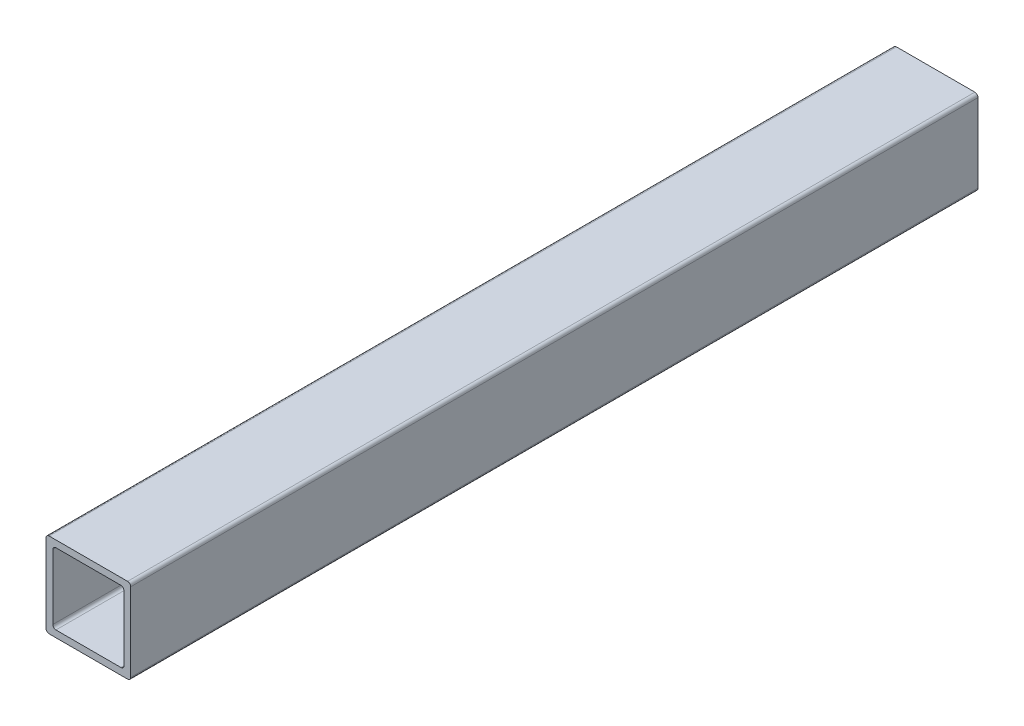
ISO-10303-21;
HEADER;
FILE_DESCRIPTION(('STEP AP214'),'2;1');
FILE_NAME('part.step','',(''),(''),'','','');
FILE_SCHEMA(('AUTOMOTIVE_DESIGN { 1 0 10303 214 1 1 1 1 }'));
ENDSEC;
DATA;
#1=APPLICATION_CONTEXT('core data for automotive mechanical design processes');
#2=APPLICATION_PROTOCOL_DEFINITION('international standard','automotive_design',2000,#1);
#3=PRODUCT_CONTEXT('',#1,'mechanical');
#4=PRODUCT('Part','Part','',(#3));
#5=PRODUCT_RELATED_PRODUCT_CATEGORY('part','',(#4));
#6=PRODUCT_DEFINITION_FORMATION('','',#4);
#7=PRODUCT_DEFINITION_CONTEXT('part definition',#1,'design');
#8=PRODUCT_DEFINITION('design','',#6,#7);
#9=PRODUCT_DEFINITION_SHAPE('','',#8);
#10=(LENGTH_UNIT() NAMED_UNIT(*) SI_UNIT(.MILLI.,.METRE.));
#11=(NAMED_UNIT(*) PLANE_ANGLE_UNIT() SI_UNIT($,.RADIAN.));
#12=(NAMED_UNIT(*) SI_UNIT($,.STERADIAN.) SOLID_ANGLE_UNIT());
#13=UNCERTAINTY_MEASURE_WITH_UNIT(LENGTH_MEASURE(1.E-05),#10,'distance_accuracy_value','');
#14=(GEOMETRIC_REPRESENTATION_CONTEXT(3) GLOBAL_UNCERTAINTY_ASSIGNED_CONTEXT((#13)) GLOBAL_UNIT_ASSIGNED_CONTEXT((#10,
#11,#12)) REPRESENTATION_CONTEXT('',''));
#15=CARTESIAN_POINT('',(0.,0.,0.));
#16=DIRECTION('',(0.,0.,1.));
#17=DIRECTION('',(1.,0.,0.));
#18=AXIS2_PLACEMENT_3D('',#15,#16,#17);
#19=CARTESIAN_POINT('',(23.153,23.153,500.));
#20=DIRECTION('',(0.,0.,-1.));
#21=DIRECTION('',(-1.,0.,0.));
#22=AXIS2_PLACEMENT_3D('',#19,#20,#21);
#23=PLANE('',#22);
#24=CARTESIAN_POINT('',(23.153,23.153,500.));
#25=DIRECTION('',(0.,0.,1.));
#26=DIRECTION('',(-1.,0.,0.));
#27=AXIS2_PLACEMENT_3D('',#24,#25,#26);
#28=CIRCLE('',#27,1.847);
#29=CARTESIAN_POINT('',(25.,23.153,500.));
#30=VERTEX_POINT('',#29);
#31=CARTESIAN_POINT('',(23.153,25.,500.));
#32=VERTEX_POINT('',#31);
#33=EDGE_CURVE('E195',#30,#32,#28,.T.);
#34=ORIENTED_EDGE('',*,*,#33,.T.);
#35=DIRECTION('',(-1.,0.,0.));
#36=VECTOR('',#35,1.);
#37=CARTESIAN_POINT('',(-23.153,25.,500.));
#38=LINE('',#37,#36);
#39=CARTESIAN_POINT('',(-23.153,25.,500.));
#40=VERTEX_POINT('',#39);
#41=EDGE_CURVE('E198',#32,#40,#38,.T.);
#42=ORIENTED_EDGE('',*,*,#41,.T.);
#43=CARTESIAN_POINT('',(-23.153,23.153,500.));
#44=DIRECTION('',(0.,0.,1.));
#45=DIRECTION('',(1.,0.,0.));
#46=AXIS2_PLACEMENT_3D('',#43,#44,#45);
#47=CIRCLE('',#46,1.847);
#48=CARTESIAN_POINT('',(-25.,23.153,500.));
#49=VERTEX_POINT('',#48);
#50=EDGE_CURVE('E201',#40,#49,#47,.T.);
#51=ORIENTED_EDGE('',*,*,#50,.T.);
#52=DIRECTION('',(0.,-1.,0.));
#53=VECTOR('',#52,1.);
#54=CARTESIAN_POINT('',(-25.,23.153,500.));
#55=LINE('',#54,#53);
#56=CARTESIAN_POINT('',(-25.,-23.153,500.));
#57=VERTEX_POINT('',#56);
#58=EDGE_CURVE('E203',#49,#57,#55,.T.);
#59=ORIENTED_EDGE('',*,*,#58,.T.);
#60=CARTESIAN_POINT('',(-23.153,-23.153,500.));
#61=DIRECTION('',(0.,0.,1.));
#62=DIRECTION('',(1.,0.,0.));
#63=AXIS2_PLACEMENT_3D('',#60,#61,#62);
#64=CIRCLE('',#63,1.847);
#65=CARTESIAN_POINT('',(-23.153,-25.,500.));
#66=VERTEX_POINT('',#65);
#67=EDGE_CURVE('E205',#57,#66,#64,.T.);
#68=ORIENTED_EDGE('',*,*,#67,.T.);
#69=DIRECTION('',(1.,0.,0.));
#70=VECTOR('',#69,1.);
#71=CARTESIAN_POINT('',(-23.153,-25.,500.));
#72=LINE('',#71,#70);
#73=CARTESIAN_POINT('',(23.153,-25.,500.));
#74=VERTEX_POINT('',#73);
#75=EDGE_CURVE('E207',#66,#74,#72,.T.);
#76=ORIENTED_EDGE('',*,*,#75,.T.);
#77=CARTESIAN_POINT('',(23.153,-23.153,500.));
#78=DIRECTION('',(0.,0.,1.));
#79=DIRECTION('',(1.,0.,0.));
#80=AXIS2_PLACEMENT_3D('',#77,#78,#79);
#81=CIRCLE('',#80,1.847);
#82=CARTESIAN_POINT('',(25.,-23.153,500.));
#83=VERTEX_POINT('',#82);
#84=EDGE_CURVE('E209',#74,#83,#81,.T.);
#85=ORIENTED_EDGE('',*,*,#84,.T.);
#86=DIRECTION('',(0.,1.,0.));
#87=VECTOR('',#86,1.);
#88=CARTESIAN_POINT('',(25.,23.153,500.));
#89=LINE('',#88,#87);
#90=EDGE_CURVE('E211',#83,#30,#89,.T.);
#91=ORIENTED_EDGE('',*,*,#90,.T.);
#92=EDGE_LOOP('',(#34,#42,#51,#59,#68,#76,#85,#91));
#93=FACE_BOUND('',#92,.T.);
#94=CARTESIAN_POINT('',(19.153,-19.153,500.));
#95=DIRECTION('',(0.,0.,1.));
#96=DIRECTION('',(1.,0.,0.));
#97=AXIS2_PLACEMENT_3D('',#94,#95,#96);
#98=CIRCLE('',#97,1.847);
#99=CARTESIAN_POINT('',(19.153,-21.,500.));
#100=VERTEX_POINT('',#99);
#101=CARTESIAN_POINT('',(21.,-19.153,500.));
#102=VERTEX_POINT('',#101);
#103=EDGE_CURVE('E130',#100,#102,#98,.T.);
#104=ORIENTED_EDGE('',*,*,#103,.F.);
#105=DIRECTION('',(1.,0.,0.));
#106=VECTOR('',#105,1.);
#107=CARTESIAN_POINT('',(-19.153,-21.,500.));
#108=LINE('',#107,#106);
#109=CARTESIAN_POINT('',(-19.153,-21.,500.));
#110=VERTEX_POINT('',#109);
#111=EDGE_CURVE('E163',#110,#100,#108,.T.);
#112=ORIENTED_EDGE('',*,*,#111,.F.);
#113=CARTESIAN_POINT('',(-19.153,-19.153,500.));
#114=DIRECTION('',(0.,0.,1.));
#115=DIRECTION('',(1.,0.,0.));
#116=AXIS2_PLACEMENT_3D('',#113,#114,#115);
#117=CIRCLE('',#116,1.847);
#118=CARTESIAN_POINT('',(-21.,-19.153,500.));
#119=VERTEX_POINT('',#118);
#120=EDGE_CURVE('E161',#119,#110,#117,.T.);
#121=ORIENTED_EDGE('',*,*,#120,.F.);
#122=DIRECTION('',(0.,-1.,0.));
#123=VECTOR('',#122,1.);
#124=CARTESIAN_POINT('',(-21.,19.153,500.));
#125=LINE('',#124,#123);
#126=CARTESIAN_POINT('',(-21.,19.153,500.));
#127=VERTEX_POINT('',#126);
#128=EDGE_CURVE('E159',#127,#119,#125,.T.);
#129=ORIENTED_EDGE('',*,*,#128,.F.);
#130=CARTESIAN_POINT('',(-19.153,19.153,500.));
#131=DIRECTION('',(0.,0.,1.));
#132=DIRECTION('',(1.,0.,0.));
#133=AXIS2_PLACEMENT_3D('',#130,#131,#132);
#134=CIRCLE('',#133,1.847);
#135=CARTESIAN_POINT('',(-19.153,21.,500.));
#136=VERTEX_POINT('',#135);
#137=EDGE_CURVE('E157',#136,#127,#134,.T.);
#138=ORIENTED_EDGE('',*,*,#137,.F.);
#139=DIRECTION('',(-1.,0.,0.));
#140=VECTOR('',#139,1.);
#141=CARTESIAN_POINT('',(-19.153,21.,500.));
#142=LINE('',#141,#140);
#143=CARTESIAN_POINT('',(19.153,21.,500.));
#144=VERTEX_POINT('',#143);
#145=EDGE_CURVE('E153',#144,#136,#142,.T.);
#146=ORIENTED_EDGE('',*,*,#145,.F.);
#147=CARTESIAN_POINT('',(19.153,19.153,500.));
#148=DIRECTION('',(0.,0.,1.));
#149=DIRECTION('',(-1.,0.,0.));
#150=AXIS2_PLACEMENT_3D('',#147,#148,#149);
#151=CIRCLE('',#150,1.847);
#152=CARTESIAN_POINT('',(21.,19.153,500.));
#153=VERTEX_POINT('',#152);
#154=EDGE_CURVE('E151',#153,#144,#151,.T.);
#155=ORIENTED_EDGE('',*,*,#154,.F.);
#156=DIRECTION('',(0.,1.,0.));
#157=VECTOR('',#156,1.);
#158=CARTESIAN_POINT('',(21.,19.153,500.));
#159=LINE('',#158,#157);
#160=EDGE_CURVE('E138',#102,#153,#159,.T.);
#161=ORIENTED_EDGE('',*,*,#160,.F.);
#162=EDGE_LOOP('',(#104,#112,#121,#129,#138,#146,#155,#161));
#163=FACE_BOUND('',#162,.T.);
#164=ADVANCED_FACE('F17',(#93,#163),#23,.F.);
#165=CARTESIAN_POINT('',(23.153,23.153,0.));
#166=DIRECTION('',(0.,0.,-1.));
#167=DIRECTION('',(-1.,0.,0.));
#168=AXIS2_PLACEMENT_3D('',#165,#166,#167);
#169=PLANE('',#168);
#170=CARTESIAN_POINT('',(23.153,23.153,0.));
#171=DIRECTION('',(0.,0.,1.));
#172=DIRECTION('',(-1.,0.,0.));
#173=AXIS2_PLACEMENT_3D('',#170,#171,#172);
#174=CIRCLE('',#173,1.847);
#175=CARTESIAN_POINT('',(25.,23.153,0.));
#176=VERTEX_POINT('',#175);
#177=CARTESIAN_POINT('',(23.153,25.,0.));
#178=VERTEX_POINT('',#177);
#179=EDGE_CURVE('E146',#176,#178,#174,.T.);
#180=ORIENTED_EDGE('',*,*,#179,.F.);
#181=DIRECTION('',(0.,1.,0.));
#182=VECTOR('',#181,1.);
#183=CARTESIAN_POINT('',(25.,23.153,0.));
#184=LINE('',#183,#182);
#185=CARTESIAN_POINT('',(25.,-23.153,0.));
#186=VERTEX_POINT('',#185);
#187=EDGE_CURVE('E199',#186,#176,#184,.T.);
#188=ORIENTED_EDGE('',*,*,#187,.F.);
#189=CARTESIAN_POINT('',(23.153,-23.153,0.));
#190=DIRECTION('',(0.,0.,1.));
#191=DIRECTION('',(1.,0.,0.));
#192=AXIS2_PLACEMENT_3D('',#189,#190,#191);
#193=CIRCLE('',#192,1.847);
#194=CARTESIAN_POINT('',(23.153,-25.,0.));
#195=VERTEX_POINT('',#194);
#196=EDGE_CURVE('E226',#195,#186,#193,.T.);
#197=ORIENTED_EDGE('',*,*,#196,.F.);
#198=DIRECTION('',(1.,0.,0.));
#199=VECTOR('',#198,1.);
#200=CARTESIAN_POINT('',(-23.153,-25.,0.));
#201=LINE('',#200,#199);
#202=CARTESIAN_POINT('',(-23.153,-25.,0.));
#203=VERTEX_POINT('',#202);
#204=EDGE_CURVE('E224',#203,#195,#201,.T.);
#205=ORIENTED_EDGE('',*,*,#204,.F.);
#206=CARTESIAN_POINT('',(-23.153,-23.153,0.));
#207=DIRECTION('',(0.,0.,1.));
#208=DIRECTION('',(1.,0.,0.));
#209=AXIS2_PLACEMENT_3D('',#206,#207,#208);
#210=CIRCLE('',#209,1.847);
#211=CARTESIAN_POINT('',(-25.,-23.153,0.));
#212=VERTEX_POINT('',#211);
#213=EDGE_CURVE('E222',#212,#203,#210,.T.);
#214=ORIENTED_EDGE('',*,*,#213,.F.);
#215=DIRECTION('',(0.,-1.,0.));
#216=VECTOR('',#215,1.);
#217=CARTESIAN_POINT('',(-25.,23.153,0.));
#218=LINE('',#217,#216);
#219=CARTESIAN_POINT('',(-25.,23.153,0.));
#220=VERTEX_POINT('',#219);
#221=EDGE_CURVE('E220',#220,#212,#218,.T.);
#222=ORIENTED_EDGE('',*,*,#221,.F.);
#223=CARTESIAN_POINT('',(-23.153,23.153,0.));
#224=DIRECTION('',(0.,0.,1.));
#225=DIRECTION('',(1.,0.,0.));
#226=AXIS2_PLACEMENT_3D('',#223,#224,#225);
#227=CIRCLE('',#226,1.847);
#228=CARTESIAN_POINT('',(-23.153,25.,0.));
#229=VERTEX_POINT('',#228);
#230=EDGE_CURVE('E218',#229,#220,#227,.T.);
#231=ORIENTED_EDGE('',*,*,#230,.F.);
#232=DIRECTION('',(-1.,0.,0.));
#233=VECTOR('',#232,1.);
#234=CARTESIAN_POINT('',(-23.153,25.,0.));
#235=LINE('',#234,#233);
#236=EDGE_CURVE('E216',#178,#229,#235,.T.);
#237=ORIENTED_EDGE('',*,*,#236,.F.);
#238=EDGE_LOOP('',(#180,#188,#197,#205,#214,#222,#231,#237));
#239=FACE_BOUND('',#238,.T.);
#240=DIRECTION('',(1.,0.,0.));
#241=VECTOR('',#240,1.);
#242=CARTESIAN_POINT('',(-19.153,-21.,0.));
#243=LINE('',#242,#241);
#244=CARTESIAN_POINT('',(-19.153,-21.,0.));
#245=VERTEX_POINT('',#244);
#246=CARTESIAN_POINT('',(19.153,-21.,0.));
#247=VERTEX_POINT('',#246);
#248=EDGE_CURVE('E139',#245,#247,#243,.T.);
#249=ORIENTED_EDGE('',*,*,#248,.T.);
#250=CARTESIAN_POINT('',(19.153,-19.153,0.));
#251=DIRECTION('',(0.,0.,1.));
#252=DIRECTION('',(1.,0.,0.));
#253=AXIS2_PLACEMENT_3D('',#250,#251,#252);
#254=CIRCLE('',#253,1.847);
#255=CARTESIAN_POINT('',(21.,-19.153,0.));
#256=VERTEX_POINT('',#255);
#257=EDGE_CURVE('E40',#247,#256,#254,.T.);
#258=ORIENTED_EDGE('',*,*,#257,.T.);
#259=DIRECTION('',(0.,1.,0.));
#260=VECTOR('',#259,1.);
#261=CARTESIAN_POINT('',(21.,19.153,0.));
#262=LINE('',#261,#260);
#263=CARTESIAN_POINT('',(21.,19.153,0.));
#264=VERTEX_POINT('',#263);
#265=EDGE_CURVE('E145',#256,#264,#262,.T.);
#266=ORIENTED_EDGE('',*,*,#265,.T.);
#267=CARTESIAN_POINT('',(19.153,19.153,0.));
#268=DIRECTION('',(0.,0.,1.));
#269=DIRECTION('',(-1.,0.,0.));
#270=AXIS2_PLACEMENT_3D('',#267,#268,#269);
#271=CIRCLE('',#270,1.847);
#272=CARTESIAN_POINT('',(19.153,21.,0.));
#273=VERTEX_POINT('',#272);
#274=EDGE_CURVE('E167',#264,#273,#271,.T.);
#275=ORIENTED_EDGE('',*,*,#274,.T.);
#276=DIRECTION('',(-1.,0.,0.));
#277=VECTOR('',#276,1.);
#278=CARTESIAN_POINT('',(-19.153,21.,0.));
#279=LINE('',#278,#277);
#280=CARTESIAN_POINT('',(-19.153,21.,0.));
#281=VERTEX_POINT('',#280);
#282=EDGE_CURVE('E170',#273,#281,#279,.T.);
#283=ORIENTED_EDGE('',*,*,#282,.T.);
#284=CARTESIAN_POINT('',(-19.153,19.153,0.));
#285=DIRECTION('',(0.,0.,1.));
#286=DIRECTION('',(1.,0.,0.));
#287=AXIS2_PLACEMENT_3D('',#284,#285,#286);
#288=CIRCLE('',#287,1.847);
#289=CARTESIAN_POINT('',(-21.,19.153,0.));
#290=VERTEX_POINT('',#289);
#291=EDGE_CURVE('E173',#281,#290,#288,.T.);
#292=ORIENTED_EDGE('',*,*,#291,.T.);
#293=DIRECTION('',(0.,-1.,0.));
#294=VECTOR('',#293,1.);
#295=CARTESIAN_POINT('',(-21.,19.153,0.));
#296=LINE('',#295,#294);
#297=CARTESIAN_POINT('',(-21.,-19.153,0.));
#298=VERTEX_POINT('',#297);
#299=EDGE_CURVE('E176',#290,#298,#296,.T.);
#300=ORIENTED_EDGE('',*,*,#299,.T.);
#301=CARTESIAN_POINT('',(-19.153,-19.153,0.));
#302=DIRECTION('',(0.,0.,1.));
#303=DIRECTION('',(1.,0.,0.));
#304=AXIS2_PLACEMENT_3D('',#301,#302,#303);
#305=CIRCLE('',#304,1.847);
#306=EDGE_CURVE('E179',#298,#245,#305,.T.);
#307=ORIENTED_EDGE('',*,*,#306,.T.);
#308=EDGE_LOOP('',(#249,#258,#266,#275,#283,#292,#300,#307));
#309=FACE_BOUND('',#308,.T.);
#310=ADVANCED_FACE('F256',(#239,#309),#169,.T.);
#311=CARTESIAN_POINT('',(23.153,23.153,500.));
#312=DIRECTION('',(0.,0.,-1.));
#313=DIRECTION('',(-1.,0.,0.));
#314=AXIS2_PLACEMENT_3D('',#311,#312,#313);
#315=CYLINDRICAL_SURFACE('',#314,1.847);
#316=ORIENTED_EDGE('',*,*,#179,.T.);
#317=DIRECTION('',(0.,0.,-1.));
#318=VECTOR('',#317,1.);
#319=CARTESIAN_POINT('',(23.153,25.,500.));
#320=LINE('',#319,#318);
#321=EDGE_CURVE('E11',#32,#178,#320,.T.);
#322=ORIENTED_EDGE('',*,*,#321,.F.);
#323=ORIENTED_EDGE('',*,*,#33,.F.);
#324=DIRECTION('',(0.,0.,-1.));
#325=VECTOR('',#324,1.);
#326=CARTESIAN_POINT('',(25.,23.153,500.));
#327=LINE('',#326,#325);
#328=EDGE_CURVE('E213',#30,#176,#327,.T.);
#329=ORIENTED_EDGE('',*,*,#328,.T.);
#330=EDGE_LOOP('',(#316,#322,#323,#329));
#331=FACE_BOUND('',#330,.T.);
#332=ADVANCED_FACE('F19',(#331),#315,.T.);
#333=CARTESIAN_POINT('',(-23.153,25.,500.));
#334=DIRECTION('',(0.,-1.,0.));
#335=DIRECTION('',(0.,0.,-1.));
#336=AXIS2_PLACEMENT_3D('',#333,#334,#335);
#337=PLANE('',#336);
#338=ORIENTED_EDGE('',*,*,#236,.T.);
#339=DIRECTION('',(0.,0.,-1.));
#340=VECTOR('',#339,1.);
#341=CARTESIAN_POINT('',(-23.153,25.,500.));
#342=LINE('',#341,#340);
#343=EDGE_CURVE('E25',#40,#229,#342,.T.);
#344=ORIENTED_EDGE('',*,*,#343,.F.);
#345=ORIENTED_EDGE('',*,*,#41,.F.);
#346=ORIENTED_EDGE('',*,*,#321,.T.);
#347=EDGE_LOOP('',(#338,#344,#345,#346));
#348=FACE_BOUND('',#347,.T.);
#349=ADVANCED_FACE('F273',(#348),#337,.F.);
#350=CARTESIAN_POINT('',(-23.153,23.153,500.));
#351=DIRECTION('',(0.,0.,-1.));
#352=DIRECTION('',(-1.,0.,0.));
#353=AXIS2_PLACEMENT_3D('',#350,#351,#352);
#354=CYLINDRICAL_SURFACE('',#353,1.847);
#355=ORIENTED_EDGE('',*,*,#230,.T.);
#356=DIRECTION('',(0.,0.,-1.));
#357=VECTOR('',#356,1.);
#358=CARTESIAN_POINT('',(-25.,23.153,500.));
#359=LINE('',#358,#357);
#360=EDGE_CURVE('E243',#49,#220,#359,.T.);
#361=ORIENTED_EDGE('',*,*,#360,.F.);
#362=ORIENTED_EDGE('',*,*,#50,.F.);
#363=ORIENTED_EDGE('',*,*,#343,.T.);
#364=EDGE_LOOP('',(#355,#361,#362,#363));
#365=FACE_BOUND('',#364,.T.);
#366=ADVANCED_FACE('F250',(#365),#354,.T.);
#367=CARTESIAN_POINT('',(-25.,23.153,500.));
#368=DIRECTION('',(1.,0.,0.));
#369=DIRECTION('',(0.,0.,-1.));
#370=AXIS2_PLACEMENT_3D('',#367,#368,#369);
#371=PLANE('',#370);
#372=ORIENTED_EDGE('',*,*,#221,.T.);
#373=DIRECTION('',(0.,0.,-1.));
#374=VECTOR('',#373,1.);
#375=CARTESIAN_POINT('',(-25.,-23.153,500.));
#376=LINE('',#375,#374);
#377=EDGE_CURVE('E240',#57,#212,#376,.T.);
#378=ORIENTED_EDGE('',*,*,#377,.F.);
#379=ORIENTED_EDGE('',*,*,#58,.F.);
#380=ORIENTED_EDGE('',*,*,#360,.T.);
#381=EDGE_LOOP('',(#372,#378,#379,#380));
#382=FACE_BOUND('',#381,.T.);
#383=ADVANCED_FACE('F262',(#382),#371,.F.);
#384=CARTESIAN_POINT('',(-23.153,-23.153,500.));
#385=DIRECTION('',(0.,0.,-1.));
#386=DIRECTION('',(-1.,0.,0.));
#387=AXIS2_PLACEMENT_3D('',#384,#385,#386);
#388=CYLINDRICAL_SURFACE('',#387,1.847);
#389=ORIENTED_EDGE('',*,*,#213,.T.);
#390=DIRECTION('',(0.,0.,-1.));
#391=VECTOR('',#390,1.);
#392=CARTESIAN_POINT('',(-23.153,-25.,500.));
#393=LINE('',#392,#391);
#394=EDGE_CURVE('E237',#66,#203,#393,.T.);
#395=ORIENTED_EDGE('',*,*,#394,.F.);
#396=ORIENTED_EDGE('',*,*,#67,.F.);
#397=ORIENTED_EDGE('',*,*,#377,.T.);
#398=EDGE_LOOP('',(#389,#395,#396,#397));
#399=FACE_BOUND('',#398,.T.);
#400=ADVANCED_FACE('F266',(#399),#388,.T.);
#401=CARTESIAN_POINT('',(-23.153,-25.,500.));
#402=DIRECTION('',(0.,1.,0.));
#403=DIRECTION('',(0.,0.,1.));
#404=AXIS2_PLACEMENT_3D('',#401,#402,#403);
#405=PLANE('',#404);
#406=ORIENTED_EDGE('',*,*,#204,.T.);
#407=DIRECTION('',(0.,0.,-1.));
#408=VECTOR('',#407,1.);
#409=CARTESIAN_POINT('',(23.153,-25.,500.));
#410=LINE('',#409,#408);
#411=EDGE_CURVE('E234',#74,#195,#410,.T.);
#412=ORIENTED_EDGE('',*,*,#411,.F.);
#413=ORIENTED_EDGE('',*,*,#75,.F.);
#414=ORIENTED_EDGE('',*,*,#394,.T.);
#415=EDGE_LOOP('',(#406,#412,#413,#414));
#416=FACE_BOUND('',#415,.T.);
#417=ADVANCED_FACE('F286',(#416),#405,.F.);
#418=CARTESIAN_POINT('',(23.153,-23.153,500.));
#419=DIRECTION('',(0.,0.,-1.));
#420=DIRECTION('',(-1.,0.,0.));
#421=AXIS2_PLACEMENT_3D('',#418,#419,#420);
#422=CYLINDRICAL_SURFACE('',#421,1.847);
#423=ORIENTED_EDGE('',*,*,#196,.T.);
#424=DIRECTION('',(0.,0.,-1.));
#425=VECTOR('',#424,1.);
#426=CARTESIAN_POINT('',(25.,-23.153,500.));
#427=LINE('',#426,#425);
#428=EDGE_CURVE('E231',#83,#186,#427,.T.);
#429=ORIENTED_EDGE('',*,*,#428,.F.);
#430=ORIENTED_EDGE('',*,*,#84,.F.);
#431=ORIENTED_EDGE('',*,*,#411,.T.);
#432=EDGE_LOOP('',(#423,#429,#430,#431));
#433=FACE_BOUND('',#432,.T.);
#434=ADVANCED_FACE('F284',(#433),#422,.T.);
#435=CARTESIAN_POINT('',(25.,23.153,500.));
#436=DIRECTION('',(-1.,0.,0.));
#437=DIRECTION('',(0.,0.,1.));
#438=AXIS2_PLACEMENT_3D('',#435,#436,#437);
#439=PLANE('',#438);
#440=ORIENTED_EDGE('',*,*,#187,.T.);
#441=ORIENTED_EDGE('',*,*,#328,.F.);
#442=ORIENTED_EDGE('',*,*,#90,.F.);
#443=ORIENTED_EDGE('',*,*,#428,.T.);
#444=EDGE_LOOP('',(#440,#441,#442,#443));
#445=FACE_BOUND('',#444,.T.);
#446=ADVANCED_FACE('F279',(#445),#439,.F.);
#447=CARTESIAN_POINT('',(19.153,-19.153,500.));
#448=DIRECTION('',(0.,0.,-1.));
#449=DIRECTION('',(-1.,0.,0.));
#450=AXIS2_PLACEMENT_3D('',#447,#448,#449);
#451=CYLINDRICAL_SURFACE('',#450,1.847);
#452=ORIENTED_EDGE('',*,*,#257,.F.);
#453=DIRECTION('',(0.,0.,-1.));
#454=VECTOR('',#453,1.);
#455=CARTESIAN_POINT('',(19.153,-21.,500.));
#456=LINE('',#455,#454);
#457=EDGE_CURVE('E134',#100,#247,#456,.T.);
#458=ORIENTED_EDGE('',*,*,#457,.F.);
#459=ORIENTED_EDGE('',*,*,#103,.T.);
#460=DIRECTION('',(0.,0.,-1.));
#461=VECTOR('',#460,1.);
#462=CARTESIAN_POINT('',(21.,-19.153,500.));
#463=LINE('',#462,#461);
#464=EDGE_CURVE('E133',#102,#256,#463,.T.);
#465=ORIENTED_EDGE('',*,*,#464,.T.);
#466=EDGE_LOOP('',(#452,#458,#459,#465));
#467=FACE_BOUND('',#466,.T.);
#468=ADVANCED_FACE('F132',(#467),#451,.F.);
#469=CARTESIAN_POINT('',(21.,19.153,500.));
#470=DIRECTION('',(-1.,0.,0.));
#471=DIRECTION('',(0.,-1.,0.));
#472=AXIS2_PLACEMENT_3D('',#469,#470,#471);
#473=PLANE('',#472);
#474=ORIENTED_EDGE('',*,*,#265,.F.);
#475=ORIENTED_EDGE('',*,*,#464,.F.);
#476=ORIENTED_EDGE('',*,*,#160,.T.);
#477=DIRECTION('',(0.,0.,-1.));
#478=VECTOR('',#477,1.);
#479=CARTESIAN_POINT('',(21.,19.153,500.));
#480=LINE('',#479,#478);
#481=EDGE_CURVE('E147',#153,#264,#480,.T.);
#482=ORIENTED_EDGE('',*,*,#481,.T.);
#483=EDGE_LOOP('',(#474,#475,#476,#482));
#484=FACE_BOUND('',#483,.T.);
#485=ADVANCED_FACE('F142',(#484),#473,.T.);
#486=CARTESIAN_POINT('',(19.153,19.153,500.));
#487=DIRECTION('',(0.,0.,-1.));
#488=DIRECTION('',(-1.,0.,0.));
#489=AXIS2_PLACEMENT_3D('',#486,#487,#488);
#490=CYLINDRICAL_SURFACE('',#489,1.847);
#491=ORIENTED_EDGE('',*,*,#274,.F.);
#492=ORIENTED_EDGE('',*,*,#481,.F.);
#493=ORIENTED_EDGE('',*,*,#154,.T.);
#494=DIRECTION('',(0.,0.,-1.));
#495=VECTOR('',#494,1.);
#496=CARTESIAN_POINT('',(19.153,21.,500.));
#497=LINE('',#496,#495);
#498=EDGE_CURVE('E192',#144,#273,#497,.T.);
#499=ORIENTED_EDGE('',*,*,#498,.T.);
#500=EDGE_LOOP('',(#491,#492,#493,#499));
#501=FACE_BOUND('',#500,.T.);
#502=ADVANCED_FACE('F316',(#501),#490,.F.);
#503=CARTESIAN_POINT('',(-19.153,21.,500.));
#504=DIRECTION('',(0.,-1.,0.));
#505=DIRECTION('',(1.,0.,0.));
#506=AXIS2_PLACEMENT_3D('',#503,#504,#505);
#507=PLANE('',#506);
#508=ORIENTED_EDGE('',*,*,#282,.F.);
#509=ORIENTED_EDGE('',*,*,#498,.F.);
#510=ORIENTED_EDGE('',*,*,#145,.T.);
#511=DIRECTION('',(0.,0.,-1.));
#512=VECTOR('',#511,1.);
#513=CARTESIAN_POINT('',(-19.153,21.,500.));
#514=LINE('',#513,#512);
#515=EDGE_CURVE('E190',#136,#281,#514,.T.);
#516=ORIENTED_EDGE('',*,*,#515,.T.);
#517=EDGE_LOOP('',(#508,#509,#510,#516));
#518=FACE_BOUND('',#517,.T.);
#519=ADVANCED_FACE('F321',(#518),#507,.T.);
#520=CARTESIAN_POINT('',(-19.153,19.153,500.));
#521=DIRECTION('',(0.,0.,-1.));
#522=DIRECTION('',(-1.,0.,0.));
#523=AXIS2_PLACEMENT_3D('',#520,#521,#522);
#524=CYLINDRICAL_SURFACE('',#523,1.847);
#525=ORIENTED_EDGE('',*,*,#291,.F.);
#526=ORIENTED_EDGE('',*,*,#515,.F.);
#527=ORIENTED_EDGE('',*,*,#137,.T.);
#528=DIRECTION('',(0.,0.,-1.));
#529=VECTOR('',#528,1.);
#530=CARTESIAN_POINT('',(-21.,19.153,500.));
#531=LINE('',#530,#529);
#532=EDGE_CURVE('E188',#127,#290,#531,.T.);
#533=ORIENTED_EDGE('',*,*,#532,.T.);
#534=EDGE_LOOP('',(#525,#526,#527,#533));
#535=FACE_BOUND('',#534,.T.);
#536=ADVANCED_FACE('F327',(#535),#524,.F.);
#537=CARTESIAN_POINT('',(-21.,19.153,500.));
#538=DIRECTION('',(1.,0.,0.));
#539=DIRECTION('',(0.,0.,-1.));
#540=AXIS2_PLACEMENT_3D('',#537,#538,#539);
#541=PLANE('',#540);
#542=ORIENTED_EDGE('',*,*,#299,.F.);
#543=ORIENTED_EDGE('',*,*,#532,.F.);
#544=ORIENTED_EDGE('',*,*,#128,.T.);
#545=DIRECTION('',(0.,0.,-1.));
#546=VECTOR('',#545,1.);
#547=CARTESIAN_POINT('',(-21.,-19.153,500.));
#548=LINE('',#547,#546);
#549=EDGE_CURVE('E186',#119,#298,#548,.T.);
#550=ORIENTED_EDGE('',*,*,#549,.T.);
#551=EDGE_LOOP('',(#542,#543,#544,#550));
#552=FACE_BOUND('',#551,.T.);
#553=ADVANCED_FACE('F331',(#552),#541,.T.);
#554=CARTESIAN_POINT('',(-19.153,-19.153,500.));
#555=DIRECTION('',(0.,0.,-1.));
#556=DIRECTION('',(-1.,0.,0.));
#557=AXIS2_PLACEMENT_3D('',#554,#555,#556);
#558=CYLINDRICAL_SURFACE('',#557,1.847);
#559=ORIENTED_EDGE('',*,*,#306,.F.);
#560=ORIENTED_EDGE('',*,*,#549,.F.);
#561=ORIENTED_EDGE('',*,*,#120,.T.);
#562=DIRECTION('',(0.,0.,-1.));
#563=VECTOR('',#562,1.);
#564=CARTESIAN_POINT('',(-19.153,-21.,500.));
#565=LINE('',#564,#563);
#566=EDGE_CURVE('E32',#110,#245,#565,.T.);
#567=ORIENTED_EDGE('',*,*,#566,.T.);
#568=EDGE_LOOP('',(#559,#560,#561,#567));
#569=FACE_BOUND('',#568,.T.);
#570=ADVANCED_FACE('F335',(#569),#558,.F.);
#571=CARTESIAN_POINT('',(-19.153,-21.,500.));
#572=DIRECTION('',(0.,1.,0.));
#573=DIRECTION('',(-1.,0.,0.));
#574=AXIS2_PLACEMENT_3D('',#571,#572,#573);
#575=PLANE('',#574);
#576=ORIENTED_EDGE('',*,*,#248,.F.);
#577=ORIENTED_EDGE('',*,*,#566,.F.);
#578=ORIENTED_EDGE('',*,*,#111,.T.);
#579=ORIENTED_EDGE('',*,*,#457,.T.);
#580=EDGE_LOOP('',(#576,#577,#578,#579));
#581=FACE_BOUND('',#580,.T.);
#582=ADVANCED_FACE('F339',(#581),#575,.T.);
#583=CLOSED_SHELL('',(#164,#310,#332,#349,#366,#383,#400,#417,#434,#446,#468,#485,#502,#519,
#536,#553,#570,#582));
#584=MANIFOLD_SOLID_BREP('B1',#583);
#585=ADVANCED_BREP_SHAPE_REPRESENTATION('',(#18,#584),#14);
#586=SHAPE_DEFINITION_REPRESENTATION(#9,#585);
ENDSEC;
END-ISO-10303-21;
